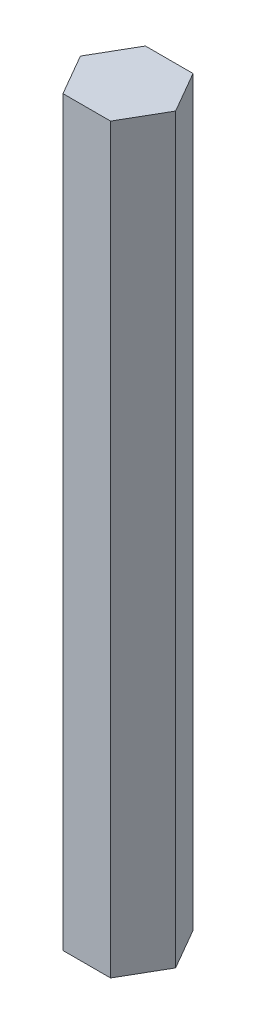
ISO-10303-21;
HEADER;
FILE_DESCRIPTION(('STEP AP214'),'2;1');
FILE_NAME('part.step','',(''),(''),'','','');
FILE_SCHEMA(('AUTOMOTIVE_DESIGN { 1 0 10303 214 1 1 1 1 }'));
ENDSEC;
DATA;
#1=APPLICATION_CONTEXT('core data for automotive mechanical design processes');
#2=APPLICATION_PROTOCOL_DEFINITION('international standard','automotive_design',2000,#1);
#3=PRODUCT_CONTEXT('',#1,'mechanical');
#4=PRODUCT('Part','Part','',(#3));
#5=PRODUCT_RELATED_PRODUCT_CATEGORY('part','',(#4));
#6=PRODUCT_DEFINITION_FORMATION('','',#4);
#7=PRODUCT_DEFINITION_CONTEXT('part definition',#1,'design');
#8=PRODUCT_DEFINITION('design','',#6,#7);
#9=PRODUCT_DEFINITION_SHAPE('','',#8);
#10=(LENGTH_UNIT() NAMED_UNIT(*) SI_UNIT(.MILLI.,.METRE.));
#11=(NAMED_UNIT(*) PLANE_ANGLE_UNIT() SI_UNIT($,.RADIAN.));
#12=(NAMED_UNIT(*) SI_UNIT($,.STERADIAN.) SOLID_ANGLE_UNIT());
#13=UNCERTAINTY_MEASURE_WITH_UNIT(LENGTH_MEASURE(1.E-05),#10,'distance_accuracy_value','');
#14=(GEOMETRIC_REPRESENTATION_CONTEXT(3) GLOBAL_UNCERTAINTY_ASSIGNED_CONTEXT((#13)) GLOBAL_UNIT_ASSIGNED_CONTEXT((#10,
#11,#12)) REPRESENTATION_CONTEXT('',''));
#15=CARTESIAN_POINT('',(0.,0.,0.));
#16=DIRECTION('',(0.,0.,1.));
#17=DIRECTION('',(1.,0.,0.));
#18=AXIS2_PLACEMENT_3D('',#15,#16,#17);
#19=CARTESIAN_POINT('',(3.66617420935412,114.3,-6.35));
#20=DIRECTION('',(0.,0.,1.));
#21=DIRECTION('',(1.,0.,0.));
#22=AXIS2_PLACEMENT_3D('',#19,#20,#21);
#23=PLANE('',#22);
#24=DIRECTION('',(-1.,0.,0.));
#25=VECTOR('',#24,1.);
#26=CARTESIAN_POINT('',(3.66617420935412,0.,-6.35));
#27=LINE('',#26,#25);
#28=CARTESIAN_POINT('',(3.66617420935412,0.,-6.35));
#29=VERTEX_POINT('',#28);
#30=CARTESIAN_POINT('',(-3.66617420935412,0.,-6.35));
#31=VERTEX_POINT('',#30);
#32=EDGE_CURVE('E132',#29,#31,#27,.T.);
#33=ORIENTED_EDGE('',*,*,#32,.T.);
#34=DIRECTION('',(0.,-1.,0.));
#35=VECTOR('',#34,1.);
#36=CARTESIAN_POINT('',(-3.66617420935412,114.3,-6.35));
#37=LINE('',#36,#35);
#38=CARTESIAN_POINT('',(-3.66617420935412,114.3,-6.35));
#39=VERTEX_POINT('',#38);
#40=EDGE_CURVE('E11',#39,#31,#37,.T.);
#41=ORIENTED_EDGE('',*,*,#40,.F.);
#42=DIRECTION('',(-1.,0.,0.));
#43=VECTOR('',#42,1.);
#44=CARTESIAN_POINT('',(3.66617420935412,114.3,-6.35));
#45=LINE('',#44,#43);
#46=CARTESIAN_POINT('',(3.66617420935412,114.3,-6.35));
#47=VERTEX_POINT('',#46);
#48=EDGE_CURVE('E148',#47,#39,#45,.T.);
#49=ORIENTED_EDGE('',*,*,#48,.F.);
#50=DIRECTION('',(0.,-1.,0.));
#51=VECTOR('',#50,1.);
#52=CARTESIAN_POINT('',(3.66617420935412,114.3,-6.35));
#53=LINE('',#52,#51);
#54=EDGE_CURVE('E128',#47,#29,#53,.T.);
#55=ORIENTED_EDGE('',*,*,#54,.T.);
#56=EDGE_LOOP('',(#33,#41,#49,#55));
#57=FACE_BOUND('',#56,.T.);
#58=ADVANCED_FACE('F43',(#57),#23,.F.);
#59=CARTESIAN_POINT('',(-3.66617420935412,114.3,-6.35));
#60=DIRECTION('',(0.866025403784438,0.,0.5));
#61=DIRECTION('',(0.5,0.,-0.866025403784439));
#62=AXIS2_PLACEMENT_3D('',#59,#60,#61);
#63=PLANE('',#62);
#64=DIRECTION('',(-0.5,0.,0.866025403784439));
#65=VECTOR('',#64,1.);
#66=CARTESIAN_POINT('',(-3.66617420935412,0.,-6.35));
#67=LINE('',#66,#65);
#68=CARTESIAN_POINT('',(-7.33234841870825,0.,0.));
#69=VERTEX_POINT('',#68);
#70=EDGE_CURVE('E136',#31,#69,#67,.T.);
#71=ORIENTED_EDGE('',*,*,#70,.T.);
#72=DIRECTION('',(0.,-1.,0.));
#73=VECTOR('',#72,1.);
#74=CARTESIAN_POINT('',(-7.33234841870825,114.3,0.));
#75=LINE('',#74,#73);
#76=CARTESIAN_POINT('',(-7.33234841870825,114.3,0.));
#77=VERTEX_POINT('',#76);
#78=EDGE_CURVE('E52',#77,#69,#75,.T.);
#79=ORIENTED_EDGE('',*,*,#78,.F.);
#80=DIRECTION('',(-0.5,0.,0.866025403784439));
#81=VECTOR('',#80,1.);
#82=CARTESIAN_POINT('',(-3.66617420935412,114.3,-6.35));
#83=LINE('',#82,#81);
#84=EDGE_CURVE('E97',#39,#77,#83,.T.);
#85=ORIENTED_EDGE('',*,*,#84,.F.);
#86=ORIENTED_EDGE('',*,*,#40,.T.);
#87=EDGE_LOOP('',(#71,#79,#85,#86));
#88=FACE_BOUND('',#87,.T.);
#89=ADVANCED_FACE('F176',(#88),#63,.F.);
#90=CARTESIAN_POINT('',(-7.33234841870825,114.3,0.));
#91=DIRECTION('',(0.866025403784439,0.,-0.5));
#92=DIRECTION('',(-0.5,0.,-0.866025403784439));
#93=AXIS2_PLACEMENT_3D('',#90,#91,#92);
#94=PLANE('',#93);
#95=DIRECTION('',(0.5,0.,0.866025403784439));
#96=VECTOR('',#95,1.);
#97=CARTESIAN_POINT('',(-7.33234841870825,0.,0.));
#98=LINE('',#97,#96);
#99=CARTESIAN_POINT('',(-3.66617420935412,0.,6.35));
#100=VERTEX_POINT('',#99);
#101=EDGE_CURVE('E139',#69,#100,#98,.T.);
#102=ORIENTED_EDGE('',*,*,#101,.T.);
#103=DIRECTION('',(0.,-1.,0.));
#104=VECTOR('',#103,1.);
#105=CARTESIAN_POINT('',(-3.66617420935412,114.3,6.35));
#106=LINE('',#105,#104);
#107=CARTESIAN_POINT('',(-3.66617420935412,114.3,6.35));
#108=VERTEX_POINT('',#107);
#109=EDGE_CURVE('E121',#108,#100,#106,.T.);
#110=ORIENTED_EDGE('',*,*,#109,.F.);
#111=DIRECTION('',(0.5,0.,0.866025403784439));
#112=VECTOR('',#111,1.);
#113=CARTESIAN_POINT('',(-7.33234841870825,114.3,0.));
#114=LINE('',#113,#112);
#115=EDGE_CURVE('E110',#77,#108,#114,.T.);
#116=ORIENTED_EDGE('',*,*,#115,.F.);
#117=ORIENTED_EDGE('',*,*,#78,.T.);
#118=EDGE_LOOP('',(#102,#110,#116,#117));
#119=FACE_BOUND('',#118,.T.);
#120=ADVANCED_FACE('F158',(#119),#94,.F.);
#121=CARTESIAN_POINT('',(-3.66617420935412,114.3,6.35));
#122=DIRECTION('',(0.,0.,-1.));
#123=DIRECTION('',(-1.,0.,0.));
#124=AXIS2_PLACEMENT_3D('',#121,#122,#123);
#125=PLANE('',#124);
#126=DIRECTION('',(1.,0.,0.));
#127=VECTOR('',#126,1.);
#128=CARTESIAN_POINT('',(-3.66617420935412,0.,6.35));
#129=LINE('',#128,#127);
#130=CARTESIAN_POINT('',(3.66617420935413,0.,6.35));
#131=VERTEX_POINT('',#130);
#132=EDGE_CURVE('E119',#100,#131,#129,.T.);
#133=ORIENTED_EDGE('',*,*,#132,.T.);
#134=DIRECTION('',(0.,-1.,0.));
#135=VECTOR('',#134,1.);
#136=CARTESIAN_POINT('',(3.66617420935413,114.3,6.35));
#137=LINE('',#136,#135);
#138=CARTESIAN_POINT('',(3.66617420935413,114.3,6.35));
#139=VERTEX_POINT('',#138);
#140=EDGE_CURVE('E116',#139,#131,#137,.T.);
#141=ORIENTED_EDGE('',*,*,#140,.F.);
#142=DIRECTION('',(1.,0.,0.));
#143=VECTOR('',#142,1.);
#144=CARTESIAN_POINT('',(-3.66617420935412,114.3,6.35));
#145=LINE('',#144,#143);
#146=EDGE_CURVE('E104',#108,#139,#145,.T.);
#147=ORIENTED_EDGE('',*,*,#146,.F.);
#148=ORIENTED_EDGE('',*,*,#109,.T.);
#149=EDGE_LOOP('',(#133,#141,#147,#148));
#150=FACE_BOUND('',#149,.T.);
#151=ADVANCED_FACE('F117',(#150),#125,.F.);
#152=CARTESIAN_POINT('',(3.66617420935413,114.3,6.35));
#153=DIRECTION('',(-0.866025403784439,0.,-0.5));
#154=DIRECTION('',(-0.5,0.,0.866025403784439));
#155=AXIS2_PLACEMENT_3D('',#152,#153,#154);
#156=PLANE('',#155);
#157=DIRECTION('',(0.5,0.,-0.866025403784439));
#158=VECTOR('',#157,1.);
#159=CARTESIAN_POINT('',(3.66617420935413,0.,6.35));
#160=LINE('',#159,#158);
#161=CARTESIAN_POINT('',(7.33234841870825,0.,0.));
#162=VERTEX_POINT('',#161);
#163=EDGE_CURVE('E83',#131,#162,#160,.T.);
#164=ORIENTED_EDGE('',*,*,#163,.T.);
#165=DIRECTION('',(0.,-1.,0.));
#166=VECTOR('',#165,1.);
#167=CARTESIAN_POINT('',(7.33234841870825,114.3,0.));
#168=LINE('',#167,#166);
#169=CARTESIAN_POINT('',(7.33234841870825,114.3,0.));
#170=VERTEX_POINT('',#169);
#171=EDGE_CURVE('E122',#170,#162,#168,.T.);
#172=ORIENTED_EDGE('',*,*,#171,.F.);
#173=DIRECTION('',(0.5,0.,-0.866025403784439));
#174=VECTOR('',#173,1.);
#175=CARTESIAN_POINT('',(3.66617420935413,114.3,6.35));
#176=LINE('',#175,#174);
#177=EDGE_CURVE('E108',#139,#170,#176,.T.);
#178=ORIENTED_EDGE('',*,*,#177,.F.);
#179=ORIENTED_EDGE('',*,*,#140,.T.);
#180=EDGE_LOOP('',(#164,#172,#178,#179));
#181=FACE_BOUND('',#180,.T.);
#182=ADVANCED_FACE('F124',(#181),#156,.F.);
#183=CARTESIAN_POINT('',(7.33234841870825,114.3,0.));
#184=DIRECTION('',(-0.866025403784439,0.,0.5));
#185=DIRECTION('',(0.5,0.,0.866025403784439));
#186=AXIS2_PLACEMENT_3D('',#183,#184,#185);
#187=PLANE('',#186);
#188=DIRECTION('',(-0.5,0.,-0.866025403784439));
#189=VECTOR('',#188,1.);
#190=CARTESIAN_POINT('',(7.33234841870825,0.,0.));
#191=LINE('',#190,#189);
#192=EDGE_CURVE('E89',#162,#29,#191,.T.);
#193=ORIENTED_EDGE('',*,*,#192,.T.);
#194=ORIENTED_EDGE('',*,*,#54,.F.);
#195=DIRECTION('',(-0.5,0.,-0.866025403784439));
#196=VECTOR('',#195,1.);
#197=CARTESIAN_POINT('',(7.33234841870825,114.3,0.));
#198=LINE('',#197,#196);
#199=EDGE_CURVE('E60',#170,#47,#198,.T.);
#200=ORIENTED_EDGE('',*,*,#199,.F.);
#201=ORIENTED_EDGE('',*,*,#171,.T.);
#202=EDGE_LOOP('',(#193,#194,#200,#201));
#203=FACE_BOUND('',#202,.T.);
#204=ADVANCED_FACE('F165',(#203),#187,.F.);
#205=CARTESIAN_POINT('',(0.,114.3,0.));
#206=DIRECTION('',(0.,1.,0.));
#207=DIRECTION('',(0.,0.,1.));
#208=AXIS2_PLACEMENT_3D('',#205,#206,#207);
#209=PLANE('',#208);
#210=ORIENTED_EDGE('',*,*,#48,.T.);
#211=ORIENTED_EDGE('',*,*,#84,.T.);
#212=ORIENTED_EDGE('',*,*,#115,.T.);
#213=ORIENTED_EDGE('',*,*,#146,.T.);
#214=ORIENTED_EDGE('',*,*,#177,.T.);
#215=ORIENTED_EDGE('',*,*,#199,.T.);
#216=EDGE_LOOP('',(#210,#211,#212,#213,#214,#215));
#217=FACE_BOUND('',#216,.T.);
#218=ADVANCED_FACE('F106',(#217),#209,.T.);
#219=CARTESIAN_POINT('',(0.,0.,0.));
#220=DIRECTION('',(0.,1.,0.));
#221=DIRECTION('',(0.,0.,1.));
#222=AXIS2_PLACEMENT_3D('',#219,#220,#221);
#223=PLANE('',#222);
#224=ORIENTED_EDGE('',*,*,#32,.F.);
#225=ORIENTED_EDGE('',*,*,#192,.F.);
#226=ORIENTED_EDGE('',*,*,#163,.F.);
#227=ORIENTED_EDGE('',*,*,#132,.F.);
#228=ORIENTED_EDGE('',*,*,#101,.F.);
#229=ORIENTED_EDGE('',*,*,#70,.F.);
#230=EDGE_LOOP('',(#224,#225,#226,#227,#228,#229));
#231=FACE_BOUND('',#230,.T.);
#232=ADVANCED_FACE('F161',(#231),#223,.F.);
#233=CLOSED_SHELL('',(#58,#89,#120,#151,#182,#204,#218,#232));
#234=MANIFOLD_SOLID_BREP('B2',#233);
#235=ADVANCED_BREP_SHAPE_REPRESENTATION('',(#18,#234),#14);
#236=SHAPE_DEFINITION_REPRESENTATION(#9,#235);
ENDSEC;
END-ISO-10303-21;
